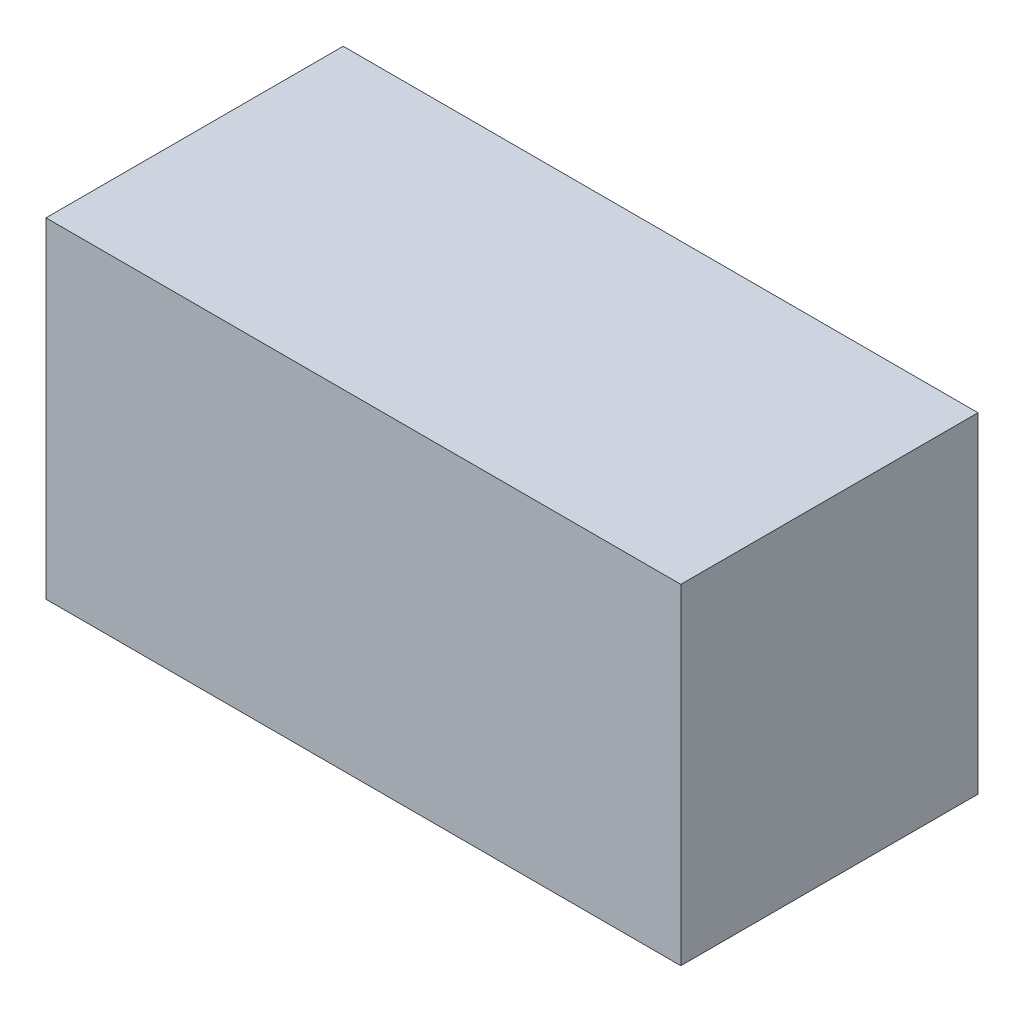
ISO-10303-21;
HEADER;
FILE_DESCRIPTION(('STEP AP214'),'2;1');
FILE_NAME('part.step','',(''),(''),'','','');
FILE_SCHEMA(('AUTOMOTIVE_DESIGN { 1 0 10303 214 1 1 1 1 }'));
ENDSEC;
DATA;
#1=APPLICATION_CONTEXT('core data for automotive mechanical design processes');
#2=APPLICATION_PROTOCOL_DEFINITION('international standard','automotive_design',2000,#1);
#3=PRODUCT_CONTEXT('',#1,'mechanical');
#4=PRODUCT('Part','Part','',(#3));
#5=PRODUCT_RELATED_PRODUCT_CATEGORY('part','',(#4));
#6=PRODUCT_DEFINITION_FORMATION('','',#4);
#7=PRODUCT_DEFINITION_CONTEXT('part definition',#1,'design');
#8=PRODUCT_DEFINITION('design','',#6,#7);
#9=PRODUCT_DEFINITION_SHAPE('','',#8);
#10=(LENGTH_UNIT() NAMED_UNIT(*) SI_UNIT(.MILLI.,.METRE.));
#11=(NAMED_UNIT(*) PLANE_ANGLE_UNIT() SI_UNIT($,.RADIAN.));
#12=(NAMED_UNIT(*) SI_UNIT($,.STERADIAN.) SOLID_ANGLE_UNIT());
#13=UNCERTAINTY_MEASURE_WITH_UNIT(LENGTH_MEASURE(1.E-05),#10,'distance_accuracy_value','');
#14=(GEOMETRIC_REPRESENTATION_CONTEXT(3) GLOBAL_UNCERTAINTY_ASSIGNED_CONTEXT((#13)) GLOBAL_UNIT_ASSIGNED_CONTEXT((#10,
#11,#12)) REPRESENTATION_CONTEXT('',''));
#15=CARTESIAN_POINT('',(0.,0.,0.));
#16=DIRECTION('',(0.,0.,1.));
#17=DIRECTION('',(1.,0.,0.));
#18=AXIS2_PLACEMENT_3D('',#15,#16,#17);
#19=CARTESIAN_POINT('',(78.1989344454509,-63.755,60.));
#20=DIRECTION('',(-1.,0.,0.));
#21=DIRECTION('',(0.,0.,1.));
#22=AXIS2_PLACEMENT_3D('',#19,#20,#21);
#23=PLANE('',#22);
#24=DIRECTION('',(0.,1.,0.));
#25=VECTOR('',#24,1.);
#26=CARTESIAN_POINT('',(78.1989344454509,-63.755,40.));
#27=LINE('',#26,#25);
#28=CARTESIAN_POINT('',(78.1989344454509,-63.755,40.));
#29=VERTEX_POINT('',#28);
#30=CARTESIAN_POINT('',(78.1989344454509,-41.5261103187277,40.));
#31=VERTEX_POINT('',#30);
#32=EDGE_CURVE('E102',#29,#31,#27,.T.);
#33=ORIENTED_EDGE('',*,*,#32,.T.);
#34=DIRECTION('',(0.,0.,-1.));
#35=VECTOR('',#34,1.);
#36=CARTESIAN_POINT('',(78.1989344454509,-41.5261103187277,60.));
#37=LINE('',#36,#35);
#38=CARTESIAN_POINT('',(78.1989344454509,-41.5261103187277,60.));
#39=VERTEX_POINT('',#38);
#40=EDGE_CURVE('E11',#39,#31,#37,.T.);
#41=ORIENTED_EDGE('',*,*,#40,.F.);
#42=DIRECTION('',(0.,1.,0.));
#43=VECTOR('',#42,1.);
#44=CARTESIAN_POINT('',(78.1989344454509,-63.755,60.));
#45=LINE('',#44,#43);
#46=CARTESIAN_POINT('',(78.1989344454509,-63.755,60.));
#47=VERTEX_POINT('',#46);
#48=EDGE_CURVE('E90',#47,#39,#45,.T.);
#49=ORIENTED_EDGE('',*,*,#48,.F.);
#50=DIRECTION('',(0.,0.,-1.));
#51=VECTOR('',#50,1.);
#52=CARTESIAN_POINT('',(78.1989344454509,-63.755,60.));
#53=LINE('',#52,#51);
#54=EDGE_CURVE('E98',#47,#29,#53,.T.);
#55=ORIENTED_EDGE('',*,*,#54,.T.);
#56=EDGE_LOOP('',(#33,#41,#49,#55));
#57=FACE_BOUND('',#56,.T.);
#58=ADVANCED_FACE('F39',(#57),#23,.F.);
#59=CARTESIAN_POINT('',(78.1989344454509,-41.5261103187277,60.));
#60=DIRECTION('',(0.,-1.,0.));
#61=DIRECTION('',(0.,0.,-1.));
#62=AXIS2_PLACEMENT_3D('',#59,#60,#61);
#63=PLANE('',#62);
#64=DIRECTION('',(-1.,0.,0.));
#65=VECTOR('',#64,1.);
#66=CARTESIAN_POINT('',(78.1989344454509,-41.5261103187277,40.));
#67=LINE('',#66,#65);
#68=CARTESIAN_POINT('',(35.4787715814382,-41.5261103187277,40.));
#69=VERTEX_POINT('',#68);
#70=EDGE_CURVE('E94',#31,#69,#67,.T.);
#71=ORIENTED_EDGE('',*,*,#70,.T.);
#72=DIRECTION('',(0.,0.,-1.));
#73=VECTOR('',#72,1.);
#74=CARTESIAN_POINT('',(35.4787715814382,-41.5261103187277,60.));
#75=LINE('',#74,#73);
#76=CARTESIAN_POINT('',(35.4787715814382,-41.5261103187277,60.));
#77=VERTEX_POINT('',#76);
#78=EDGE_CURVE('E47',#77,#69,#75,.T.);
#79=ORIENTED_EDGE('',*,*,#78,.F.);
#80=DIRECTION('',(-1.,0.,0.));
#81=VECTOR('',#80,1.);
#82=CARTESIAN_POINT('',(78.1989344454509,-41.5261103187277,60.));
#83=LINE('',#82,#81);
#84=EDGE_CURVE('E85',#39,#77,#83,.T.);
#85=ORIENTED_EDGE('',*,*,#84,.F.);
#86=ORIENTED_EDGE('',*,*,#40,.T.);
#87=EDGE_LOOP('',(#71,#79,#85,#86));
#88=FACE_BOUND('',#87,.T.);
#89=ADVANCED_FACE('F93',(#88),#63,.F.);
#90=CARTESIAN_POINT('',(35.4787715814382,-63.755,60.));
#91=DIRECTION('',(1.,0.,0.));
#92=DIRECTION('',(0.,0.,-1.));
#93=AXIS2_PLACEMENT_3D('',#90,#91,#92);
#94=PLANE('',#93);
#95=DIRECTION('',(0.,-1.,0.));
#96=VECTOR('',#95,1.);
#97=CARTESIAN_POINT('',(35.4787715814382,-63.755,40.));
#98=LINE('',#97,#96);
#99=CARTESIAN_POINT('',(35.4787715814382,-63.755,40.));
#100=VERTEX_POINT('',#99);
#101=EDGE_CURVE('E72',#69,#100,#98,.T.);
#102=ORIENTED_EDGE('',*,*,#101,.T.);
#103=DIRECTION('',(0.,0.,-1.));
#104=VECTOR('',#103,1.);
#105=CARTESIAN_POINT('',(35.4787715814382,-63.755,60.));
#106=LINE('',#105,#104);
#107=CARTESIAN_POINT('',(35.4787715814382,-63.755,60.));
#108=VERTEX_POINT('',#107);
#109=EDGE_CURVE('E95',#108,#100,#106,.T.);
#110=ORIENTED_EDGE('',*,*,#109,.F.);
#111=DIRECTION('',(0.,-1.,0.));
#112=VECTOR('',#111,1.);
#113=CARTESIAN_POINT('',(35.4787715814382,-63.755,60.));
#114=LINE('',#113,#112);
#115=EDGE_CURVE('E88',#77,#108,#114,.T.);
#116=ORIENTED_EDGE('',*,*,#115,.F.);
#117=ORIENTED_EDGE('',*,*,#78,.T.);
#118=EDGE_LOOP('',(#102,#110,#116,#117));
#119=FACE_BOUND('',#118,.T.);
#120=ADVANCED_FACE('F96',(#119),#94,.F.);
#121=CARTESIAN_POINT('',(78.1989344454509,-63.755,60.));
#122=DIRECTION('',(0.,1.,0.));
#123=DIRECTION('',(0.,0.,1.));
#124=AXIS2_PLACEMENT_3D('',#121,#122,#123);
#125=PLANE('',#124);
#126=DIRECTION('',(1.,0.,0.));
#127=VECTOR('',#126,1.);
#128=CARTESIAN_POINT('',(78.1989344454509,-63.755,40.));
#129=LINE('',#128,#127);
#130=EDGE_CURVE('E78',#100,#29,#129,.T.);
#131=ORIENTED_EDGE('',*,*,#130,.T.);
#132=ORIENTED_EDGE('',*,*,#54,.F.);
#133=DIRECTION('',(1.,0.,0.));
#134=VECTOR('',#133,1.);
#135=CARTESIAN_POINT('',(78.1989344454509,-63.755,60.));
#136=LINE('',#135,#134);
#137=EDGE_CURVE('E55',#108,#47,#136,.T.);
#138=ORIENTED_EDGE('',*,*,#137,.F.);
#139=ORIENTED_EDGE('',*,*,#109,.T.);
#140=EDGE_LOOP('',(#131,#132,#138,#139));
#141=FACE_BOUND('',#140,.T.);
#142=ADVANCED_FACE('F109',(#141),#125,.F.);
#143=CARTESIAN_POINT('',(0.,0.,60.));
#144=DIRECTION('',(0.,0.,1.));
#145=DIRECTION('',(1.,0.,0.));
#146=AXIS2_PLACEMENT_3D('',#143,#144,#145);
#147=PLANE('',#146);
#148=ORIENTED_EDGE('',*,*,#48,.T.);
#149=ORIENTED_EDGE('',*,*,#84,.T.);
#150=ORIENTED_EDGE('',*,*,#115,.T.);
#151=ORIENTED_EDGE('',*,*,#137,.T.);
#152=EDGE_LOOP('',(#148,#149,#150,#151));
#153=FACE_BOUND('',#152,.T.);
#154=ADVANCED_FACE('F86',(#153),#147,.T.);
#155=CARTESIAN_POINT('',(0.,0.,40.));
#156=DIRECTION('',(0.,0.,1.));
#157=DIRECTION('',(1.,0.,0.));
#158=AXIS2_PLACEMENT_3D('',#155,#156,#157);
#159=PLANE('',#158);
#160=ORIENTED_EDGE('',*,*,#32,.F.);
#161=ORIENTED_EDGE('',*,*,#130,.F.);
#162=ORIENTED_EDGE('',*,*,#101,.F.);
#163=ORIENTED_EDGE('',*,*,#70,.F.);
#164=EDGE_LOOP('',(#160,#161,#162,#163));
#165=FACE_BOUND('',#164,.T.);
#166=ADVANCED_FACE('F112',(#165),#159,.F.);
#167=CLOSED_SHELL('',(#58,#89,#120,#142,#154,#166));
#168=MANIFOLD_SOLID_BREP('B2',#167);
#169=ADVANCED_BREP_SHAPE_REPRESENTATION('',(#18,#168),#14);
#170=SHAPE_DEFINITION_REPRESENTATION(#9,#169);
ENDSEC;
END-ISO-10303-21;
